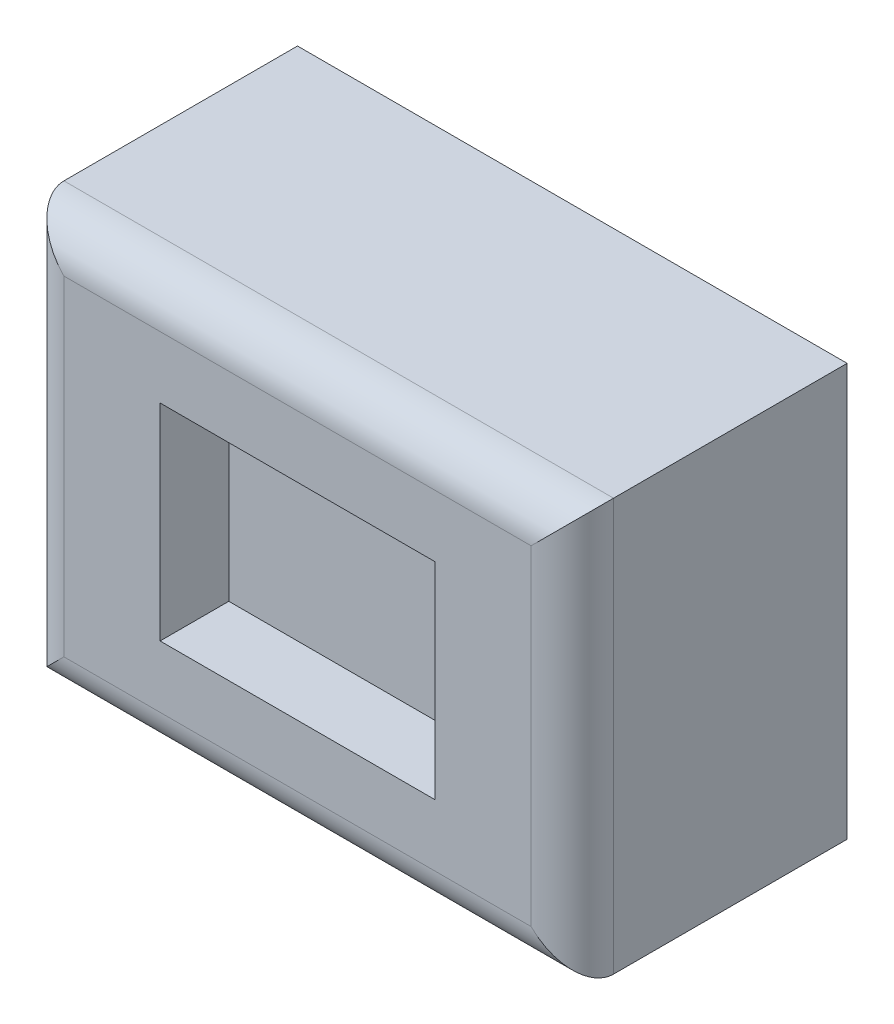
ISO-10303-21;
HEADER;
FILE_DESCRIPTION(('STEP AP214'),'2;1');
FILE_NAME('part.step','',(''),(''),'','','');
FILE_SCHEMA(('AUTOMOTIVE_DESIGN { 1 0 10303 214 1 1 1 1 }'));
ENDSEC;
DATA;
#1=APPLICATION_CONTEXT('core data for automotive mechanical design processes');
#2=APPLICATION_PROTOCOL_DEFINITION('international standard','automotive_design',2000,#1);
#3=PRODUCT_CONTEXT('',#1,'mechanical');
#4=PRODUCT('Part','Part','',(#3));
#5=PRODUCT_RELATED_PRODUCT_CATEGORY('part','',(#4));
#6=PRODUCT_DEFINITION_FORMATION('','',#4);
#7=PRODUCT_DEFINITION_CONTEXT('part definition',#1,'design');
#8=PRODUCT_DEFINITION('design','',#6,#7);
#9=PRODUCT_DEFINITION_SHAPE('','',#8);
#10=(LENGTH_UNIT() NAMED_UNIT(*) SI_UNIT(.MILLI.,.METRE.));
#11=(NAMED_UNIT(*) PLANE_ANGLE_UNIT() SI_UNIT($,.RADIAN.));
#12=(NAMED_UNIT(*) SI_UNIT($,.STERADIAN.) SOLID_ANGLE_UNIT());
#13=UNCERTAINTY_MEASURE_WITH_UNIT(LENGTH_MEASURE(1.E-05),#10,'distance_accuracy_value','');
#14=(GEOMETRIC_REPRESENTATION_CONTEXT(3) GLOBAL_UNCERTAINTY_ASSIGNED_CONTEXT((#13)) GLOBAL_UNIT_ASSIGNED_CONTEXT((#10,
#11,#12)) REPRESENTATION_CONTEXT('',''));
#15=CARTESIAN_POINT('',(0.,0.,0.));
#16=DIRECTION('',(0.,0.,1.));
#17=DIRECTION('',(1.,0.,0.));
#18=AXIS2_PLACEMENT_3D('',#15,#16,#17);
#19=CARTESIAN_POINT('',(-20.,-15.,20.));
#20=DIRECTION('',(1.,0.,0.));
#21=DIRECTION('',(0.,0.,-1.));
#22=AXIS2_PLACEMENT_3D('',#19,#20,#21);
#23=PLANE('',#22);
#24=DIRECTION('',(0.,0.,-1.));
#25=VECTOR('',#24,1.);
#26=CARTESIAN_POINT('',(-20.,-15.,20.));
#27=LINE('',#26,#25);
#28=CARTESIAN_POINT('',(-20.,-15.,17.));
#29=VERTEX_POINT('',#28);
#30=CARTESIAN_POINT('',(-20.,-15.,0.));
#31=VERTEX_POINT('',#30);
#32=EDGE_CURVE('E180',#29,#31,#27,.T.);
#33=ORIENTED_EDGE('',*,*,#32,.F.);
#34=DIRECTION('',(0.,-1.,0.));
#35=VECTOR('',#34,1.);
#36=CARTESIAN_POINT('',(-20.,-15.,17.));
#37=LINE('',#36,#35);
#38=CARTESIAN_POINT('',(-20.,15.,17.));
#39=VERTEX_POINT('',#38);
#40=EDGE_CURVE('E186',#29,#39,#37,.F.);
#41=ORIENTED_EDGE('',*,*,#40,.T.);
#42=DIRECTION('',(0.,0.,-1.));
#43=VECTOR('',#42,1.);
#44=CARTESIAN_POINT('',(-20.,15.,20.));
#45=LINE('',#44,#43);
#46=CARTESIAN_POINT('',(-20.,15.,0.));
#47=VERTEX_POINT('',#46);
#48=EDGE_CURVE('E175',#39,#47,#45,.T.);
#49=ORIENTED_EDGE('',*,*,#48,.T.);
#50=DIRECTION('',(0.,-1.,0.));
#51=VECTOR('',#50,1.);
#52=CARTESIAN_POINT('',(-20.,-15.,0.));
#53=LINE('',#52,#51);
#54=EDGE_CURVE('E160',#47,#31,#53,.T.);
#55=ORIENTED_EDGE('',*,*,#54,.T.);
#56=EDGE_LOOP('',(#33,#41,#49,#55));
#57=FACE_BOUND('',#56,.T.);
#58=ADVANCED_FACE('F41',(#57),#23,.F.);
#59=CARTESIAN_POINT('',(-20.,-15.,20.));
#60=DIRECTION('',(0.,1.,0.));
#61=DIRECTION('',(0.,0.,1.));
#62=AXIS2_PLACEMENT_3D('',#59,#60,#61);
#63=PLANE('',#62);
#64=DIRECTION('',(0.,0.,-1.));
#65=VECTOR('',#64,1.);
#66=CARTESIAN_POINT('',(20.,-15.,20.));
#67=LINE('',#66,#65);
#68=CARTESIAN_POINT('',(20.,-15.,17.));
#69=VERTEX_POINT('',#68);
#70=CARTESIAN_POINT('',(20.,-15.,0.));
#71=VERTEX_POINT('',#70);
#72=EDGE_CURVE('E179',#69,#71,#67,.T.);
#73=ORIENTED_EDGE('',*,*,#72,.F.);
#74=DIRECTION('',(1.,0.,0.));
#75=VECTOR('',#74,1.);
#76=CARTESIAN_POINT('',(-20.,-15.,17.));
#77=LINE('',#76,#75);
#78=EDGE_CURVE('E191',#69,#29,#77,.F.);
#79=ORIENTED_EDGE('',*,*,#78,.T.);
#80=ORIENTED_EDGE('',*,*,#32,.T.);
#81=DIRECTION('',(1.,0.,0.));
#82=VECTOR('',#81,1.);
#83=CARTESIAN_POINT('',(-20.,-15.,0.));
#84=LINE('',#83,#82);
#85=EDGE_CURVE('E162',#31,#71,#84,.T.);
#86=ORIENTED_EDGE('',*,*,#85,.T.);
#87=EDGE_LOOP('',(#73,#79,#80,#86));
#88=FACE_BOUND('',#87,.T.);
#89=ADVANCED_FACE('F216',(#88),#63,.F.);
#90=CARTESIAN_POINT('',(20.,-15.,20.));
#91=DIRECTION('',(-1.,0.,0.));
#92=DIRECTION('',(0.,0.,1.));
#93=AXIS2_PLACEMENT_3D('',#90,#91,#92);
#94=PLANE('',#93);
#95=DIRECTION('',(0.,0.,-1.));
#96=VECTOR('',#95,1.);
#97=CARTESIAN_POINT('',(20.,15.,20.));
#98=LINE('',#97,#96);
#99=CARTESIAN_POINT('',(20.,15.,17.));
#100=VERTEX_POINT('',#99);
#101=CARTESIAN_POINT('',(20.,15.,0.));
#102=VERTEX_POINT('',#101);
#103=EDGE_CURVE('E171',#100,#102,#98,.T.);
#104=ORIENTED_EDGE('',*,*,#103,.F.);
#105=DIRECTION('',(0.,1.,0.));
#106=VECTOR('',#105,1.);
#107=CARTESIAN_POINT('',(20.,-15.,17.));
#108=LINE('',#107,#106);
#109=EDGE_CURVE('E49',#100,#69,#108,.F.);
#110=ORIENTED_EDGE('',*,*,#109,.T.);
#111=ORIENTED_EDGE('',*,*,#72,.T.);
#112=DIRECTION('',(0.,1.,0.));
#113=VECTOR('',#112,1.);
#114=CARTESIAN_POINT('',(20.,-15.,0.));
#115=LINE('',#114,#113);
#116=EDGE_CURVE('E167',#71,#102,#115,.T.);
#117=ORIENTED_EDGE('',*,*,#116,.T.);
#118=EDGE_LOOP('',(#104,#110,#111,#117));
#119=FACE_BOUND('',#118,.T.);
#120=ADVANCED_FACE('F252',(#119),#94,.F.);
#121=CARTESIAN_POINT('',(-20.,15.,20.));
#122=DIRECTION('',(0.,-1.,0.));
#123=DIRECTION('',(0.,0.,-1.));
#124=AXIS2_PLACEMENT_3D('',#121,#122,#123);
#125=PLANE('',#124);
#126=ORIENTED_EDGE('',*,*,#48,.F.);
#127=DIRECTION('',(-1.,0.,0.));
#128=VECTOR('',#127,1.);
#129=CARTESIAN_POINT('',(-20.,15.,17.));
#130=LINE('',#129,#128);
#131=EDGE_CURVE('E11',#39,#100,#130,.F.);
#132=ORIENTED_EDGE('',*,*,#131,.T.);
#133=ORIENTED_EDGE('',*,*,#103,.T.);
#134=DIRECTION('',(-1.,0.,0.));
#135=VECTOR('',#134,1.);
#136=CARTESIAN_POINT('',(-20.,15.,0.));
#137=LINE('',#136,#135);
#138=EDGE_CURVE('E166',#102,#47,#137,.T.);
#139=ORIENTED_EDGE('',*,*,#138,.T.);
#140=EDGE_LOOP('',(#126,#132,#133,#139));
#141=FACE_BOUND('',#140,.T.);
#142=ADVANCED_FACE('F226',(#141),#125,.F.);
#143=CARTESIAN_POINT('',(0.,0.,20.));
#144=DIRECTION('',(0.,0.,-1.));
#145=DIRECTION('',(-1.,0.,0.));
#146=AXIS2_PLACEMENT_3D('',#143,#144,#145);
#147=PLANE('',#146);
#148=DIRECTION('',(-1.,0.,0.));
#149=VECTOR('',#148,1.);
#150=CARTESIAN_POINT('',(0.,12.,20.));
#151=LINE('',#150,#149);
#152=CARTESIAN_POINT('',(17.,12.,20.));
#153=VERTEX_POINT('',#152);
#154=CARTESIAN_POINT('',(-17.,12.,20.));
#155=VERTEX_POINT('',#154);
#156=EDGE_CURVE('E177',#153,#155,#151,.T.);
#157=ORIENTED_EDGE('',*,*,#156,.T.);
#158=DIRECTION('',(0.,-1.,0.));
#159=VECTOR('',#158,1.);
#160=CARTESIAN_POINT('',(-17.,0.,20.));
#161=LINE('',#160,#159);
#162=CARTESIAN_POINT('',(-17.,-12.,20.));
#163=VERTEX_POINT('',#162);
#164=EDGE_CURVE('E187',#155,#163,#161,.T.);
#165=ORIENTED_EDGE('',*,*,#164,.T.);
#166=DIRECTION('',(1.,0.,0.));
#167=VECTOR('',#166,1.);
#168=CARTESIAN_POINT('',(0.,-12.,20.));
#169=LINE('',#168,#167);
#170=CARTESIAN_POINT('',(17.,-12.,20.));
#171=VERTEX_POINT('',#170);
#172=EDGE_CURVE('E184',#163,#171,#169,.T.);
#173=ORIENTED_EDGE('',*,*,#172,.T.);
#174=DIRECTION('',(0.,1.,0.));
#175=VECTOR('',#174,1.);
#176=CARTESIAN_POINT('',(17.,0.,20.));
#177=LINE('',#176,#175);
#178=EDGE_CURVE('E185',#171,#153,#177,.T.);
#179=ORIENTED_EDGE('',*,*,#178,.T.);
#180=EDGE_LOOP('',(#157,#165,#173,#179));
#181=FACE_BOUND('',#180,.T.);
#182=DIRECTION('',(1.,0.,0.));
#183=VECTOR('',#182,1.);
#184=CARTESIAN_POINT('',(-10.,-7.5,20.));
#185=LINE('',#184,#183);
#186=CARTESIAN_POINT('',(-10.,-7.5,20.));
#187=VERTEX_POINT('',#186);
#188=CARTESIAN_POINT('',(10.,-7.5,20.));
#189=VERTEX_POINT('',#188);
#190=EDGE_CURVE('E151',#187,#189,#185,.T.);
#191=ORIENTED_EDGE('',*,*,#190,.F.);
#192=DIRECTION('',(0.,-1.,0.));
#193=VECTOR('',#192,1.);
#194=CARTESIAN_POINT('',(-10.,-7.5,20.));
#195=LINE('',#194,#193);
#196=CARTESIAN_POINT('',(-10.,7.5,20.));
#197=VERTEX_POINT('',#196);
#198=EDGE_CURVE('E122',#197,#187,#195,.T.);
#199=ORIENTED_EDGE('',*,*,#198,.F.);
#200=DIRECTION('',(-1.,0.,0.));
#201=VECTOR('',#200,1.);
#202=CARTESIAN_POINT('',(-10.,7.5,20.));
#203=LINE('',#202,#201);
#204=CARTESIAN_POINT('',(10.,7.5,20.));
#205=VERTEX_POINT('',#204);
#206=EDGE_CURVE('E142',#205,#197,#203,.T.);
#207=ORIENTED_EDGE('',*,*,#206,.F.);
#208=DIRECTION('',(0.,1.,0.));
#209=VECTOR('',#208,1.);
#210=CARTESIAN_POINT('',(10.,-7.5,20.));
#211=LINE('',#210,#209);
#212=EDGE_CURVE('E144',#189,#205,#211,.T.);
#213=ORIENTED_EDGE('',*,*,#212,.F.);
#214=EDGE_LOOP('',(#191,#199,#207,#213));
#215=FACE_BOUND('',#214,.T.);
#216=ADVANCED_FACE('F223',(#181,#215),#147,.F.);
#217=CARTESIAN_POINT('',(0.,0.,0.));
#218=DIRECTION('',(0.,0.,-1.));
#219=DIRECTION('',(-1.,0.,0.));
#220=AXIS2_PLACEMENT_3D('',#217,#218,#219);
#221=PLANE('',#220);
#222=ORIENTED_EDGE('',*,*,#54,.F.);
#223=ORIENTED_EDGE('',*,*,#138,.F.);
#224=ORIENTED_EDGE('',*,*,#116,.F.);
#225=ORIENTED_EDGE('',*,*,#85,.F.);
#226=EDGE_LOOP('',(#222,#223,#224,#225));
#227=FACE_BOUND('',#226,.T.);
#228=ADVANCED_FACE('F229',(#227),#221,.T.);
#229=CARTESIAN_POINT('',(-10.,-7.5,15.));
#230=DIRECTION('',(-1.,0.,0.));
#231=DIRECTION('',(0.,0.,1.));
#232=AXIS2_PLACEMENT_3D('',#229,#230,#231);
#233=PLANE('',#232);
#234=ORIENTED_EDGE('',*,*,#198,.T.);
#235=DIRECTION('',(0.,0.,1.));
#236=VECTOR('',#235,1.);
#237=CARTESIAN_POINT('',(-10.,-7.5,15.));
#238=LINE('',#237,#236);
#239=CARTESIAN_POINT('',(-10.,-7.5,15.));
#240=VERTEX_POINT('',#239);
#241=EDGE_CURVE('E119',#240,#187,#238,.T.);
#242=ORIENTED_EDGE('',*,*,#241,.F.);
#243=DIRECTION('',(0.,-1.,0.));
#244=VECTOR('',#243,1.);
#245=CARTESIAN_POINT('',(-10.,-7.5,15.));
#246=LINE('',#245,#244);
#247=CARTESIAN_POINT('',(-10.,7.5,15.));
#248=VERTEX_POINT('',#247);
#249=EDGE_CURVE('E121',#248,#240,#246,.T.);
#250=ORIENTED_EDGE('',*,*,#249,.F.);
#251=DIRECTION('',(0.,0.,1.));
#252=VECTOR('',#251,1.);
#253=CARTESIAN_POINT('',(-10.,7.5,15.));
#254=LINE('',#253,#252);
#255=EDGE_CURVE('E154',#248,#197,#254,.T.);
#256=ORIENTED_EDGE('',*,*,#255,.T.);
#257=EDGE_LOOP('',(#234,#242,#250,#256));
#258=FACE_BOUND('',#257,.T.);
#259=ADVANCED_FACE('F118',(#258),#233,.F.);
#260=CARTESIAN_POINT('',(-10.,7.5,15.));
#261=DIRECTION('',(0.,1.,0.));
#262=DIRECTION('',(0.,0.,1.));
#263=AXIS2_PLACEMENT_3D('',#260,#261,#262);
#264=PLANE('',#263);
#265=ORIENTED_EDGE('',*,*,#206,.T.);
#266=ORIENTED_EDGE('',*,*,#255,.F.);
#267=DIRECTION('',(-1.,0.,0.));
#268=VECTOR('',#267,1.);
#269=CARTESIAN_POINT('',(-10.,7.5,15.));
#270=LINE('',#269,#268);
#271=CARTESIAN_POINT('',(10.,7.5,15.));
#272=VERTEX_POINT('',#271);
#273=EDGE_CURVE('E128',#272,#248,#270,.T.);
#274=ORIENTED_EDGE('',*,*,#273,.F.);
#275=DIRECTION('',(0.,0.,1.));
#276=VECTOR('',#275,1.);
#277=CARTESIAN_POINT('',(10.,7.5,15.));
#278=LINE('',#277,#276);
#279=EDGE_CURVE('E158',#272,#205,#278,.T.);
#280=ORIENTED_EDGE('',*,*,#279,.T.);
#281=EDGE_LOOP('',(#265,#266,#274,#280));
#282=FACE_BOUND('',#281,.T.);
#283=ADVANCED_FACE('F237',(#282),#264,.F.);
#284=CARTESIAN_POINT('',(10.,-7.5,15.));
#285=DIRECTION('',(1.,0.,0.));
#286=DIRECTION('',(0.,0.,-1.));
#287=AXIS2_PLACEMENT_3D('',#284,#285,#286);
#288=PLANE('',#287);
#289=ORIENTED_EDGE('',*,*,#212,.T.);
#290=ORIENTED_EDGE('',*,*,#279,.F.);
#291=DIRECTION('',(0.,1.,0.));
#292=VECTOR('',#291,1.);
#293=CARTESIAN_POINT('',(10.,-7.5,15.));
#294=LINE('',#293,#292);
#295=CARTESIAN_POINT('',(10.,-7.5,15.));
#296=VERTEX_POINT('',#295);
#297=EDGE_CURVE('E140',#296,#272,#294,.T.);
#298=ORIENTED_EDGE('',*,*,#297,.F.);
#299=DIRECTION('',(0.,0.,1.));
#300=VECTOR('',#299,1.);
#301=CARTESIAN_POINT('',(10.,-7.5,15.));
#302=LINE('',#301,#300);
#303=EDGE_CURVE('E129',#296,#189,#302,.T.);
#304=ORIENTED_EDGE('',*,*,#303,.T.);
#305=EDGE_LOOP('',(#289,#290,#298,#304));
#306=FACE_BOUND('',#305,.T.);
#307=ADVANCED_FACE('F233',(#306),#288,.F.);
#308=CARTESIAN_POINT('',(-10.,-7.5,15.));
#309=DIRECTION('',(0.,-1.,0.));
#310=DIRECTION('',(0.,0.,-1.));
#311=AXIS2_PLACEMENT_3D('',#308,#309,#310);
#312=PLANE('',#311);
#313=ORIENTED_EDGE('',*,*,#190,.T.);
#314=ORIENTED_EDGE('',*,*,#303,.F.);
#315=DIRECTION('',(1.,0.,0.));
#316=VECTOR('',#315,1.);
#317=CARTESIAN_POINT('',(-10.,-7.5,15.));
#318=LINE('',#317,#316);
#319=EDGE_CURVE('E134',#240,#296,#318,.T.);
#320=ORIENTED_EDGE('',*,*,#319,.F.);
#321=ORIENTED_EDGE('',*,*,#241,.T.);
#322=EDGE_LOOP('',(#313,#314,#320,#321));
#323=FACE_BOUND('',#322,.T.);
#324=ADVANCED_FACE('F131',(#323),#312,.F.);
#325=CARTESIAN_POINT('',(0.,0.,15.));
#326=DIRECTION('',(0.,0.,-1.));
#327=DIRECTION('',(-1.,0.,0.));
#328=AXIS2_PLACEMENT_3D('',#325,#326,#327);
#329=PLANE('',#328);
#330=ORIENTED_EDGE('',*,*,#249,.T.);
#331=ORIENTED_EDGE('',*,*,#319,.T.);
#332=ORIENTED_EDGE('',*,*,#297,.T.);
#333=ORIENTED_EDGE('',*,*,#273,.T.);
#334=EDGE_LOOP('',(#330,#331,#332,#333));
#335=FACE_BOUND('',#334,.T.);
#336=ADVANCED_FACE('F137',(#335),#329,.F.);
#337=CARTESIAN_POINT('',(17.,0.,17.));
#338=DIRECTION('',(0.,1.,0.));
#339=DIRECTION('',(0.,0.,1.));
#340=AXIS2_PLACEMENT_3D('',#337,#338,#339);
#341=CYLINDRICAL_SURFACE('',#340,3.);
#342=CARTESIAN_POINT('',(17.,-12.,17.));
#343=DIRECTION('',(0.707106781186547,0.707106781186547,0.));
#344=DIRECTION('',(-0.707106781186547,0.707106781186547,0.));
#345=AXIS2_PLACEMENT_3D('',#342,#343,#344);
#346=ELLIPSE('',#345,4.24264068711928,3.);
#347=EDGE_CURVE('E196',#69,#171,#346,.F.);
#348=ORIENTED_EDGE('',*,*,#347,.F.);
#349=ORIENTED_EDGE('',*,*,#109,.F.);
#350=CARTESIAN_POINT('',(17.,12.,17.));
#351=DIRECTION('',(-0.707106781186547,0.707106781186547,0.));
#352=DIRECTION('',(-0.707106781186547,-0.707106781186547,0.));
#353=AXIS2_PLACEMENT_3D('',#350,#351,#352);
#354=ELLIPSE('',#353,4.24264068711928,3.);
#355=EDGE_CURVE('E44',#153,#100,#354,.T.);
#356=ORIENTED_EDGE('',*,*,#355,.F.);
#357=ORIENTED_EDGE('',*,*,#178,.F.);
#358=EDGE_LOOP('',(#348,#349,#356,#357));
#359=FACE_BOUND('',#358,.T.);
#360=ADVANCED_FACE('F43',(#359),#341,.T.);
#361=CARTESIAN_POINT('',(0.,12.,17.));
#362=DIRECTION('',(-1.,0.,0.));
#363=DIRECTION('',(0.,0.,1.));
#364=AXIS2_PLACEMENT_3D('',#361,#362,#363);
#365=CYLINDRICAL_SURFACE('',#364,3.);
#366=ORIENTED_EDGE('',*,*,#355,.T.);
#367=ORIENTED_EDGE('',*,*,#131,.F.);
#368=CARTESIAN_POINT('',(-17.,12.,17.));
#369=DIRECTION('',(-0.707106781186547,-0.707106781186547,0.));
#370=DIRECTION('',(-0.707106781186547,0.707106781186547,0.));
#371=AXIS2_PLACEMENT_3D('',#368,#369,#370);
#372=ELLIPSE('',#371,4.24264068711928,3.);
#373=EDGE_CURVE('E197',#155,#39,#372,.T.);
#374=ORIENTED_EDGE('',*,*,#373,.F.);
#375=ORIENTED_EDGE('',*,*,#156,.F.);
#376=EDGE_LOOP('',(#366,#367,#374,#375));
#377=FACE_BOUND('',#376,.T.);
#378=ADVANCED_FACE('F208',(#377),#365,.T.);
#379=CARTESIAN_POINT('',(0.,-12.,17.));
#380=DIRECTION('',(1.,0.,0.));
#381=DIRECTION('',(0.,0.,-1.));
#382=AXIS2_PLACEMENT_3D('',#379,#380,#381);
#383=CYLINDRICAL_SURFACE('',#382,3.);
#384=ORIENTED_EDGE('',*,*,#347,.T.);
#385=ORIENTED_EDGE('',*,*,#172,.F.);
#386=CARTESIAN_POINT('',(-17.,-12.,17.));
#387=DIRECTION('',(0.707106781186547,-0.707106781186547,0.));
#388=DIRECTION('',(0.707106781186547,0.707106781186547,0.));
#389=AXIS2_PLACEMENT_3D('',#386,#387,#388);
#390=ELLIPSE('',#389,4.24264068711928,3.);
#391=EDGE_CURVE('E192',#29,#163,#390,.F.);
#392=ORIENTED_EDGE('',*,*,#391,.F.);
#393=ORIENTED_EDGE('',*,*,#78,.F.);
#394=EDGE_LOOP('',(#384,#385,#392,#393));
#395=FACE_BOUND('',#394,.T.);
#396=ADVANCED_FACE('F213',(#395),#383,.T.);
#397=CARTESIAN_POINT('',(-17.,0.,17.));
#398=DIRECTION('',(0.,-1.,0.));
#399=DIRECTION('',(0.,0.,-1.));
#400=AXIS2_PLACEMENT_3D('',#397,#398,#399);
#401=CYLINDRICAL_SURFACE('',#400,3.);
#402=ORIENTED_EDGE('',*,*,#373,.T.);
#403=ORIENTED_EDGE('',*,*,#40,.F.);
#404=ORIENTED_EDGE('',*,*,#391,.T.);
#405=ORIENTED_EDGE('',*,*,#164,.F.);
#406=EDGE_LOOP('',(#402,#403,#404,#405));
#407=FACE_BOUND('',#406,.T.);
#408=ADVANCED_FACE('F225',(#407),#401,.T.);
#409=CLOSED_SHELL('',(#58,#89,#120,#142,#216,#228,#259,#283,#307,#324,#336,#360,#378,#396,#408));
#410=MANIFOLD_SOLID_BREP('B2',#409);
#411=ADVANCED_BREP_SHAPE_REPRESENTATION('',(#18,#410),#14);
#412=SHAPE_DEFINITION_REPRESENTATION(#9,#411);
ENDSEC;
END-ISO-10303-21;
